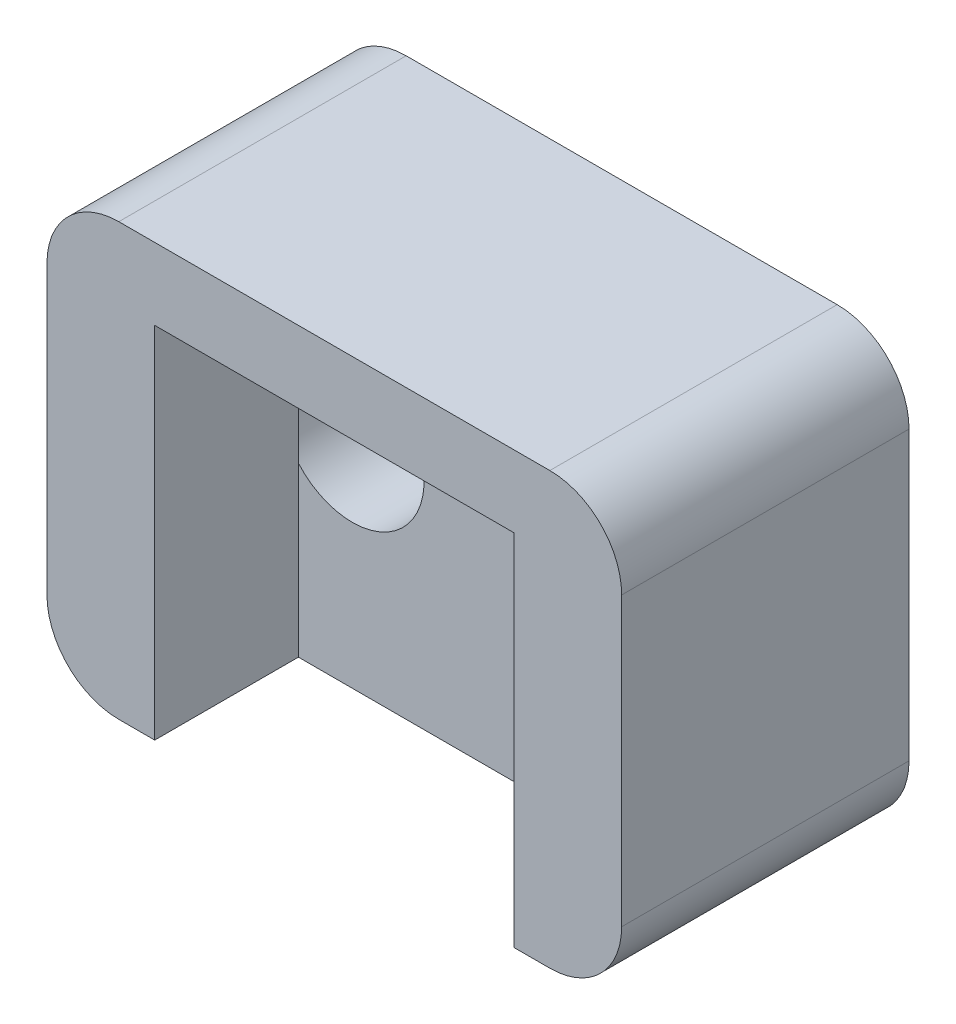
ISO-10303-21;
HEADER;
FILE_DESCRIPTION(('STEP AP214'),'2;1');
FILE_NAME('part.step','',(''),(''),'','','');
FILE_SCHEMA(('AUTOMOTIVE_DESIGN { 1 0 10303 214 1 1 1 1 }'));
ENDSEC;
DATA;
#1=APPLICATION_CONTEXT('core data for automotive mechanical design processes');
#2=APPLICATION_PROTOCOL_DEFINITION('international standard','automotive_design',2000,#1);
#3=PRODUCT_CONTEXT('',#1,'mechanical');
#4=PRODUCT('Part','Part','',(#3));
#5=PRODUCT_RELATED_PRODUCT_CATEGORY('part','',(#4));
#6=PRODUCT_DEFINITION_FORMATION('','',#4);
#7=PRODUCT_DEFINITION_CONTEXT('part definition',#1,'design');
#8=PRODUCT_DEFINITION('design','',#6,#7);
#9=PRODUCT_DEFINITION_SHAPE('','',#8);
#10=(LENGTH_UNIT() NAMED_UNIT(*) SI_UNIT(.MILLI.,.METRE.));
#11=(NAMED_UNIT(*) PLANE_ANGLE_UNIT() SI_UNIT($,.RADIAN.));
#12=(NAMED_UNIT(*) SI_UNIT($,.STERADIAN.) SOLID_ANGLE_UNIT());
#13=UNCERTAINTY_MEASURE_WITH_UNIT(LENGTH_MEASURE(1.E-05),#10,'distance_accuracy_value','');
#14=(GEOMETRIC_REPRESENTATION_CONTEXT(3) GLOBAL_UNCERTAINTY_ASSIGNED_CONTEXT((#13)) GLOBAL_UNIT_ASSIGNED_CONTEXT((#10,
#11,#12)) REPRESENTATION_CONTEXT('',''));
#15=CARTESIAN_POINT('',(0.,0.,0.));
#16=DIRECTION('',(0.,0.,1.));
#17=DIRECTION('',(1.,0.,0.));
#18=AXIS2_PLACEMENT_3D('',#15,#16,#17);
#19=CARTESIAN_POINT('',(-8.75,0.,10.));
#20=DIRECTION('',(0.,0.,-1.));
#21=DIRECTION('',(-1.,0.,0.));
#22=AXIS2_PLACEMENT_3D('',#19,#20,#21);
#23=PLANE('',#22);
#24=CARTESIAN_POINT('',(-8.75,0.,10.));
#25=DIRECTION('',(0.,0.,-1.));
#26=DIRECTION('',(-1.,0.,0.));
#27=AXIS2_PLACEMENT_3D('',#24,#25,#26);
#28=CIRCLE('',#27,5.);
#29=CARTESIAN_POINT('',(-12.5,-3.30718913883073,10.));
#30=VERTEX_POINT('',#29);
#31=CARTESIAN_POINT('',(-12.5,3.30718913883073,10.));
#32=VERTEX_POINT('',#31);
#33=EDGE_CURVE('E188',#30,#32,#28,.T.);
#34=ORIENTED_EDGE('',*,*,#33,.T.);
#35=DIRECTION('',(0.,-1.,0.));
#36=VECTOR('',#35,1.);
#37=CARTESIAN_POINT('',(-12.5,-15.,10.));
#38=LINE('',#37,#36);
#39=EDGE_CURVE('E141',#32,#30,#38,.T.);
#40=ORIENTED_EDGE('',*,*,#39,.T.);
#41=EDGE_LOOP('',(#34,#40));
#42=FACE_BOUND('',#41,.T.);
#43=ADVANCED_FACE('F33',(#42),#23,.T.);
#44=CARTESIAN_POINT('',(8.75,0.,10.));
#45=DIRECTION('',(0.,0.,-1.));
#46=DIRECTION('',(-1.,0.,0.));
#47=AXIS2_PLACEMENT_3D('',#44,#45,#46);
#48=PLANE('',#47);
#49=CARTESIAN_POINT('',(8.75,0.,10.));
#50=DIRECTION('',(0.,0.,-1.));
#51=DIRECTION('',(-1.,0.,0.));
#52=AXIS2_PLACEMENT_3D('',#49,#50,#51);
#53=CIRCLE('',#52,5.);
#54=CARTESIAN_POINT('',(12.5,3.30718913883074,10.));
#55=VERTEX_POINT('',#54);
#56=CARTESIAN_POINT('',(12.5,-3.30718913883074,10.));
#57=VERTEX_POINT('',#56);
#58=EDGE_CURVE('E177',#55,#57,#53,.T.);
#59=ORIENTED_EDGE('',*,*,#58,.T.);
#60=DIRECTION('',(0.,1.,0.));
#61=VECTOR('',#60,1.);
#62=CARTESIAN_POINT('',(12.5,-15.,10.));
#63=LINE('',#62,#61);
#64=EDGE_CURVE('E159',#57,#55,#63,.T.);
#65=ORIENTED_EDGE('',*,*,#64,.T.);
#66=EDGE_LOOP('',(#59,#65));
#67=FACE_BOUND('',#66,.T.);
#68=ADVANCED_FACE('F291',(#67),#48,.T.);
#69=CARTESIAN_POINT('',(20.,15.,20.));
#70=DIRECTION('',(-1.,0.,0.));
#71=DIRECTION('',(0.,-1.,0.));
#72=AXIS2_PLACEMENT_3D('',#69,#70,#71);
#73=PLANE('',#72);
#74=DIRECTION('',(0.,1.,0.));
#75=VECTOR('',#74,1.);
#76=CARTESIAN_POINT('',(20.,15.,0.));
#77=LINE('',#76,#75);
#78=CARTESIAN_POINT('',(20.,-10.,0.));
#79=VERTEX_POINT('',#78);
#80=CARTESIAN_POINT('',(20.,10.,0.));
#81=VERTEX_POINT('',#80);
#82=EDGE_CURVE('E180',#79,#81,#77,.T.);
#83=ORIENTED_EDGE('',*,*,#82,.T.);
#84=DIRECTION('',(0.,0.,-1.));
#85=VECTOR('',#84,1.);
#86=CARTESIAN_POINT('',(20.,10.,20.));
#87=LINE('',#86,#85);
#88=CARTESIAN_POINT('',(20.,10.,20.));
#89=VERTEX_POINT('',#88);
#90=EDGE_CURVE('E228',#81,#89,#87,.F.);
#91=ORIENTED_EDGE('',*,*,#90,.T.);
#92=DIRECTION('',(0.,1.,0.));
#93=VECTOR('',#92,1.);
#94=CARTESIAN_POINT('',(20.,15.,20.));
#95=LINE('',#94,#93);
#96=CARTESIAN_POINT('',(20.,-10.,20.));
#97=VERTEX_POINT('',#96);
#98=EDGE_CURVE('E189',#97,#89,#95,.T.);
#99=ORIENTED_EDGE('',*,*,#98,.F.);
#100=DIRECTION('',(0.,0.,-1.));
#101=VECTOR('',#100,1.);
#102=CARTESIAN_POINT('',(20.,-10.,20.));
#103=LINE('',#102,#101);
#104=EDGE_CURVE('E225',#97,#79,#103,.T.);
#105=ORIENTED_EDGE('',*,*,#104,.T.);
#106=EDGE_LOOP('',(#83,#91,#99,#105));
#107=FACE_BOUND('',#106,.T.);
#108=ADVANCED_FACE('F273',(#107),#73,.F.);
#109=CARTESIAN_POINT('',(-20.,15.,20.));
#110=DIRECTION('',(0.,-1.,0.));
#111=DIRECTION('',(0.,0.,-1.));
#112=AXIS2_PLACEMENT_3D('',#109,#110,#111);
#113=PLANE('',#112);
#114=DIRECTION('',(-1.,0.,0.));
#115=VECTOR('',#114,1.);
#116=CARTESIAN_POINT('',(-20.,15.,20.));
#117=LINE('',#116,#115);
#118=CARTESIAN_POINT('',(15.,15.,20.));
#119=VERTEX_POINT('',#118);
#120=CARTESIAN_POINT('',(-15.,15.,20.));
#121=VERTEX_POINT('',#120);
#122=EDGE_CURVE('E192',#119,#121,#117,.T.);
#123=ORIENTED_EDGE('',*,*,#122,.F.);
#124=DIRECTION('',(0.,0.,-1.));
#125=VECTOR('',#124,1.);
#126=CARTESIAN_POINT('',(15.,15.,20.));
#127=LINE('',#126,#125);
#128=CARTESIAN_POINT('',(15.,15.,0.));
#129=VERTEX_POINT('',#128);
#130=EDGE_CURVE('E214',#119,#129,#127,.T.);
#131=ORIENTED_EDGE('',*,*,#130,.T.);
#132=DIRECTION('',(-1.,0.,0.));
#133=VECTOR('',#132,1.);
#134=CARTESIAN_POINT('',(-20.,15.,0.));
#135=LINE('',#134,#133);
#136=CARTESIAN_POINT('',(-15.,15.,0.));
#137=VERTEX_POINT('',#136);
#138=EDGE_CURVE('E205',#129,#137,#135,.T.);
#139=ORIENTED_EDGE('',*,*,#138,.T.);
#140=DIRECTION('',(0.,0.,-1.));
#141=VECTOR('',#140,1.);
#142=CARTESIAN_POINT('',(-15.,15.,20.));
#143=LINE('',#142,#141);
#144=EDGE_CURVE('E202',#137,#121,#143,.F.);
#145=ORIENTED_EDGE('',*,*,#144,.T.);
#146=EDGE_LOOP('',(#123,#131,#139,#145));
#147=FACE_BOUND('',#146,.T.);
#148=ADVANCED_FACE('F267',(#147),#113,.F.);
#149=CARTESIAN_POINT('',(-20.,15.,20.));
#150=DIRECTION('',(1.,0.,0.));
#151=DIRECTION('',(0.,1.,0.));
#152=AXIS2_PLACEMENT_3D('',#149,#150,#151);
#153=PLANE('',#152);
#154=DIRECTION('',(0.,-1.,0.));
#155=VECTOR('',#154,1.);
#156=CARTESIAN_POINT('',(-20.,15.,0.));
#157=LINE('',#156,#155);
#158=CARTESIAN_POINT('',(-20.,10.,0.));
#159=VERTEX_POINT('',#158);
#160=CARTESIAN_POINT('',(-20.,-10.,0.));
#161=VERTEX_POINT('',#160);
#162=EDGE_CURVE('E208',#159,#161,#157,.T.);
#163=ORIENTED_EDGE('',*,*,#162,.T.);
#164=DIRECTION('',(0.,0.,-1.));
#165=VECTOR('',#164,1.);
#166=CARTESIAN_POINT('',(-20.,-10.,20.));
#167=LINE('',#166,#165);
#168=CARTESIAN_POINT('',(-20.,-10.,20.));
#169=VERTEX_POINT('',#168);
#170=EDGE_CURVE('E11',#161,#169,#167,.F.);
#171=ORIENTED_EDGE('',*,*,#170,.T.);
#172=DIRECTION('',(0.,-1.,0.));
#173=VECTOR('',#172,1.);
#174=CARTESIAN_POINT('',(-20.,15.,20.));
#175=LINE('',#174,#173);
#176=CARTESIAN_POINT('',(-20.,10.,20.));
#177=VERTEX_POINT('',#176);
#178=EDGE_CURVE('E196',#177,#169,#175,.T.);
#179=ORIENTED_EDGE('',*,*,#178,.F.);
#180=DIRECTION('',(0.,0.,-1.));
#181=VECTOR('',#180,1.);
#182=CARTESIAN_POINT('',(-20.,10.,20.));
#183=LINE('',#182,#181);
#184=EDGE_CURVE('E41',#177,#159,#183,.T.);
#185=ORIENTED_EDGE('',*,*,#184,.T.);
#186=EDGE_LOOP('',(#163,#171,#179,#185));
#187=FACE_BOUND('',#186,.T.);
#188=ADVANCED_FACE('F248',(#187),#153,.F.);
#189=CARTESIAN_POINT('',(-20.,-15.,20.));
#190=DIRECTION('',(0.,1.,0.));
#191=DIRECTION('',(0.,0.,1.));
#192=AXIS2_PLACEMENT_3D('',#189,#190,#191);
#193=PLANE('',#192);
#194=DIRECTION('',(1.,0.,0.));
#195=VECTOR('',#194,1.);
#196=CARTESIAN_POINT('',(-12.5,-15.,10.));
#197=LINE('',#196,#195);
#198=CARTESIAN_POINT('',(-12.5,-15.,10.));
#199=VERTEX_POINT('',#198);
#200=CARTESIAN_POINT('',(12.5,-15.,10.));
#201=VERTEX_POINT('',#200);
#202=EDGE_CURVE('E135',#199,#201,#197,.T.);
#203=ORIENTED_EDGE('',*,*,#202,.F.);
#204=DIRECTION('',(0.,0.,1.));
#205=VECTOR('',#204,1.);
#206=CARTESIAN_POINT('',(-12.5,-15.,10.));
#207=LINE('',#206,#205);
#208=CARTESIAN_POINT('',(-12.5,-15.,20.));
#209=VERTEX_POINT('',#208);
#210=EDGE_CURVE('E146',#199,#209,#207,.T.);
#211=ORIENTED_EDGE('',*,*,#210,.T.);
#212=DIRECTION('',(1.,0.,0.));
#213=VECTOR('',#212,1.);
#214=CARTESIAN_POINT('',(-20.,-15.,20.));
#215=LINE('',#214,#213);
#216=CARTESIAN_POINT('',(-15.,-15.,20.));
#217=VERTEX_POINT('',#216);
#218=EDGE_CURVE('E200',#217,#209,#215,.T.);
#219=ORIENTED_EDGE('',*,*,#218,.F.);
#220=DIRECTION('',(0.,0.,-1.));
#221=VECTOR('',#220,1.);
#222=CARTESIAN_POINT('',(-15.,-15.,20.));
#223=LINE('',#222,#221);
#224=CARTESIAN_POINT('',(-15.,-15.,0.));
#225=VERTEX_POINT('',#224);
#226=EDGE_CURVE('E238',#217,#225,#223,.T.);
#227=ORIENTED_EDGE('',*,*,#226,.T.);
#228=DIRECTION('',(1.,0.,0.));
#229=VECTOR('',#228,1.);
#230=CARTESIAN_POINT('',(-20.,-15.,0.));
#231=LINE('',#230,#229);
#232=CARTESIAN_POINT('',(15.,-15.,0.));
#233=VERTEX_POINT('',#232);
#234=EDGE_CURVE('E193',#225,#233,#231,.T.);
#235=ORIENTED_EDGE('',*,*,#234,.T.);
#236=DIRECTION('',(0.,0.,-1.));
#237=VECTOR('',#236,1.);
#238=CARTESIAN_POINT('',(15.,-15.,20.));
#239=LINE('',#238,#237);
#240=CARTESIAN_POINT('',(15.,-15.,20.));
#241=VERTEX_POINT('',#240);
#242=EDGE_CURVE('E241',#233,#241,#239,.F.);
#243=ORIENTED_EDGE('',*,*,#242,.T.);
#244=CARTESIAN_POINT('',(12.5,-15.,20.));
#245=VERTEX_POINT('',#244);
#246=EDGE_CURVE('E199',#245,#241,#215,.T.);
#247=ORIENTED_EDGE('',*,*,#246,.F.);
#248=DIRECTION('',(0.,0.,1.));
#249=VECTOR('',#248,1.);
#250=CARTESIAN_POINT('',(12.5,-15.,10.));
#251=LINE('',#250,#249);
#252=EDGE_CURVE('E153',#201,#245,#251,.T.);
#253=ORIENTED_EDGE('',*,*,#252,.F.);
#254=EDGE_LOOP('',(#203,#211,#219,#227,#235,#243,#247,#253));
#255=FACE_BOUND('',#254,.T.);
#256=ADVANCED_FACE('F156',(#255),#193,.F.);
#257=CARTESIAN_POINT('',(0.,0.,20.));
#258=DIRECTION('',(0.,0.,1.));
#259=DIRECTION('',(1.,0.,0.));
#260=AXIS2_PLACEMENT_3D('',#257,#258,#259);
#261=PLANE('',#260);
#262=DIRECTION('',(0.,-1.,0.));
#263=VECTOR('',#262,1.);
#264=CARTESIAN_POINT('',(-12.5,-15.,20.));
#265=LINE('',#264,#263);
#266=CARTESIAN_POINT('',(-12.5,10.,20.));
#267=VERTEX_POINT('',#266);
#268=EDGE_CURVE('E149',#267,#209,#265,.T.);
#269=ORIENTED_EDGE('',*,*,#268,.F.);
#270=DIRECTION('',(-1.,0.,0.));
#271=VECTOR('',#270,1.);
#272=CARTESIAN_POINT('',(-12.5,10.,20.));
#273=LINE('',#272,#271);
#274=CARTESIAN_POINT('',(12.5,10.,20.));
#275=VERTEX_POINT('',#274);
#276=EDGE_CURVE('E142',#275,#267,#273,.T.);
#277=ORIENTED_EDGE('',*,*,#276,.F.);
#278=DIRECTION('',(0.,1.,0.));
#279=VECTOR('',#278,1.);
#280=CARTESIAN_POINT('',(12.5,-15.,20.));
#281=LINE('',#280,#279);
#282=EDGE_CURVE('E166',#245,#275,#281,.T.);
#283=ORIENTED_EDGE('',*,*,#282,.F.);
#284=ORIENTED_EDGE('',*,*,#246,.T.);
#285=CARTESIAN_POINT('',(15.,-10.,20.));
#286=DIRECTION('',(0.,0.,1.));
#287=DIRECTION('',(1.,0.,0.));
#288=AXIS2_PLACEMENT_3D('',#285,#286,#287);
#289=CIRCLE('',#288,5.);
#290=EDGE_CURVE('E234',#241,#97,#289,.T.);
#291=ORIENTED_EDGE('',*,*,#290,.T.);
#292=ORIENTED_EDGE('',*,*,#98,.T.);
#293=CARTESIAN_POINT('',(15.,10.,20.));
#294=DIRECTION('',(0.,0.,1.));
#295=DIRECTION('',(1.,0.,0.));
#296=AXIS2_PLACEMENT_3D('',#293,#294,#295);
#297=CIRCLE('',#296,5.);
#298=EDGE_CURVE('E236',#89,#119,#297,.T.);
#299=ORIENTED_EDGE('',*,*,#298,.T.);
#300=ORIENTED_EDGE('',*,*,#122,.T.);
#301=CARTESIAN_POINT('',(-15.,10.,20.));
#302=DIRECTION('',(0.,0.,1.));
#303=DIRECTION('',(1.,0.,0.));
#304=AXIS2_PLACEMENT_3D('',#301,#302,#303);
#305=CIRCLE('',#304,5.);
#306=EDGE_CURVE('E230',#121,#177,#305,.T.);
#307=ORIENTED_EDGE('',*,*,#306,.T.);
#308=ORIENTED_EDGE('',*,*,#178,.T.);
#309=CARTESIAN_POINT('',(-15.,-10.,20.));
#310=DIRECTION('',(0.,0.,1.));
#311=DIRECTION('',(1.,0.,0.));
#312=AXIS2_PLACEMENT_3D('',#309,#310,#311);
#313=CIRCLE('',#312,5.);
#314=EDGE_CURVE('E232',#169,#217,#313,.T.);
#315=ORIENTED_EDGE('',*,*,#314,.T.);
#316=ORIENTED_EDGE('',*,*,#218,.T.);
#317=EDGE_LOOP('',(#269,#277,#283,#284,#291,#292,#299,#300,#307,#308,#315,#316));
#318=FACE_BOUND('',#317,.T.);
#319=ADVANCED_FACE('F262',(#318),#261,.T.);
#320=CARTESIAN_POINT('',(0.,0.,0.));
#321=DIRECTION('',(0.,0.,1.));
#322=DIRECTION('',(1.,0.,0.));
#323=AXIS2_PLACEMENT_3D('',#320,#321,#322);
#324=PLANE('',#323);
#325=CARTESIAN_POINT('',(8.75,0.,0.));
#326=DIRECTION('',(0.,0.,-1.));
#327=DIRECTION('',(-1.,0.,0.));
#328=AXIS2_PLACEMENT_3D('',#325,#326,#327);
#329=CIRCLE('',#328,5.);
#330=CARTESIAN_POINT('',(3.75,0.,0.));
#331=VERTEX_POINT('',#330);
#332=EDGE_CURVE('E181',#331,#331,#329,.T.);
#333=ORIENTED_EDGE('',*,*,#332,.F.);
#334=EDGE_LOOP('',(#333));
#335=FACE_BOUND('',#334,.T.);
#336=CARTESIAN_POINT('',(-8.75,0.,0.));
#337=DIRECTION('',(0.,0.,-1.));
#338=DIRECTION('',(-1.,0.,0.));
#339=AXIS2_PLACEMENT_3D('',#336,#337,#338);
#340=CIRCLE('',#339,5.);
#341=CARTESIAN_POINT('',(-13.75,0.,0.));
#342=VERTEX_POINT('',#341);
#343=EDGE_CURVE('E184',#342,#342,#340,.T.);
#344=ORIENTED_EDGE('',*,*,#343,.F.);
#345=EDGE_LOOP('',(#344));
#346=FACE_BOUND('',#345,.T.);
#347=ORIENTED_EDGE('',*,*,#138,.F.);
#348=CARTESIAN_POINT('',(15.,10.,0.));
#349=DIRECTION('',(0.,0.,1.));
#350=DIRECTION('',(1.,0.,0.));
#351=AXIS2_PLACEMENT_3D('',#348,#349,#350);
#352=CIRCLE('',#351,5.);
#353=EDGE_CURVE('E223',#129,#81,#352,.F.);
#354=ORIENTED_EDGE('',*,*,#353,.T.);
#355=ORIENTED_EDGE('',*,*,#82,.F.);
#356=CARTESIAN_POINT('',(15.,-10.,0.));
#357=DIRECTION('',(0.,0.,1.));
#358=DIRECTION('',(1.,0.,0.));
#359=AXIS2_PLACEMENT_3D('',#356,#357,#358);
#360=CIRCLE('',#359,5.);
#361=EDGE_CURVE('E221',#79,#233,#360,.F.);
#362=ORIENTED_EDGE('',*,*,#361,.T.);
#363=ORIENTED_EDGE('',*,*,#234,.F.);
#364=CARTESIAN_POINT('',(-15.,-10.,0.));
#365=DIRECTION('',(0.,0.,1.));
#366=DIRECTION('',(1.,0.,0.));
#367=AXIS2_PLACEMENT_3D('',#364,#365,#366);
#368=CIRCLE('',#367,5.);
#369=EDGE_CURVE('E219',#225,#161,#368,.F.);
#370=ORIENTED_EDGE('',*,*,#369,.T.);
#371=ORIENTED_EDGE('',*,*,#162,.F.);
#372=CARTESIAN_POINT('',(-15.,10.,0.));
#373=DIRECTION('',(0.,0.,1.));
#374=DIRECTION('',(1.,0.,0.));
#375=AXIS2_PLACEMENT_3D('',#372,#373,#374);
#376=CIRCLE('',#375,5.);
#377=EDGE_CURVE('E217',#159,#137,#376,.F.);
#378=ORIENTED_EDGE('',*,*,#377,.T.);
#379=EDGE_LOOP('',(#347,#354,#355,#362,#363,#370,#371,#378));
#380=FACE_BOUND('',#379,.T.);
#381=ADVANCED_FACE('F254',(#335,#346,#380),#324,.F.);
#382=CARTESIAN_POINT('',(15.,10.,20.));
#383=DIRECTION('',(0.,0.,-1.));
#384=DIRECTION('',(-1.,0.,0.));
#385=AXIS2_PLACEMENT_3D('',#382,#383,#384);
#386=CYLINDRICAL_SURFACE('',#385,5.);
#387=ORIENTED_EDGE('',*,*,#298,.F.);
#388=ORIENTED_EDGE('',*,*,#90,.F.);
#389=ORIENTED_EDGE('',*,*,#353,.F.);
#390=ORIENTED_EDGE('',*,*,#130,.F.);
#391=EDGE_LOOP('',(#387,#388,#389,#390));
#392=FACE_BOUND('',#391,.T.);
#393=ADVANCED_FACE('F277',(#392),#386,.T.);
#394=CARTESIAN_POINT('',(15.,-10.,20.));
#395=DIRECTION('',(0.,0.,-1.));
#396=DIRECTION('',(-1.,0.,0.));
#397=AXIS2_PLACEMENT_3D('',#394,#395,#396);
#398=CYLINDRICAL_SURFACE('',#397,5.);
#399=ORIENTED_EDGE('',*,*,#290,.F.);
#400=ORIENTED_EDGE('',*,*,#242,.F.);
#401=ORIENTED_EDGE('',*,*,#361,.F.);
#402=ORIENTED_EDGE('',*,*,#104,.F.);
#403=EDGE_LOOP('',(#399,#400,#401,#402));
#404=FACE_BOUND('',#403,.T.);
#405=ADVANCED_FACE('F280',(#404),#398,.T.);
#406=CARTESIAN_POINT('',(-15.,-10.,20.));
#407=DIRECTION('',(0.,0.,-1.));
#408=DIRECTION('',(-1.,0.,0.));
#409=AXIS2_PLACEMENT_3D('',#406,#407,#408);
#410=CYLINDRICAL_SURFACE('',#409,5.);
#411=ORIENTED_EDGE('',*,*,#314,.F.);
#412=ORIENTED_EDGE('',*,*,#170,.F.);
#413=ORIENTED_EDGE('',*,*,#369,.F.);
#414=ORIENTED_EDGE('',*,*,#226,.F.);
#415=EDGE_LOOP('',(#411,#412,#413,#414));
#416=FACE_BOUND('',#415,.T.);
#417=ADVANCED_FACE('F259',(#416),#410,.T.);
#418=CARTESIAN_POINT('',(-15.,10.,20.));
#419=DIRECTION('',(0.,0.,-1.));
#420=DIRECTION('',(-1.,0.,0.));
#421=AXIS2_PLACEMENT_3D('',#418,#419,#420);
#422=CYLINDRICAL_SURFACE('',#421,5.);
#423=ORIENTED_EDGE('',*,*,#306,.F.);
#424=ORIENTED_EDGE('',*,*,#144,.F.);
#425=ORIENTED_EDGE('',*,*,#377,.F.);
#426=ORIENTED_EDGE('',*,*,#184,.F.);
#427=EDGE_LOOP('',(#423,#424,#425,#426));
#428=FACE_BOUND('',#427,.T.);
#429=ADVANCED_FACE('F35',(#428),#422,.T.);
#430=CARTESIAN_POINT('',(-8.75,0.,10.));
#431=DIRECTION('',(0.,0.,-1.));
#432=DIRECTION('',(-1.,0.,0.));
#433=AXIS2_PLACEMENT_3D('',#430,#431,#432);
#434=CYLINDRICAL_SURFACE('',#433,5.);
#435=EDGE_CURVE('E139',#32,#30,#28,.T.);
#436=ORIENTED_EDGE('',*,*,#435,.F.);
#437=ORIENTED_EDGE('',*,*,#33,.F.);
#438=EDGE_LOOP('',(#436,#437));
#439=FACE_BOUND('',#438,.T.);
#440=ORIENTED_EDGE('',*,*,#343,.T.);
#441=EDGE_LOOP('',(#440));
#442=FACE_BOUND('',#441,.T.);
#443=ADVANCED_FACE('F306',(#439,#442),#434,.F.);
#444=CARTESIAN_POINT('',(8.75,0.,10.));
#445=DIRECTION('',(0.,0.,-1.));
#446=DIRECTION('',(-1.,0.,0.));
#447=AXIS2_PLACEMENT_3D('',#444,#445,#446);
#448=CYLINDRICAL_SURFACE('',#447,5.);
#449=ORIENTED_EDGE('',*,*,#58,.F.);
#450=EDGE_CURVE('E173',#57,#55,#53,.T.);
#451=ORIENTED_EDGE('',*,*,#450,.F.);
#452=EDGE_LOOP('',(#449,#451));
#453=FACE_BOUND('',#452,.T.);
#454=ORIENTED_EDGE('',*,*,#332,.T.);
#455=EDGE_LOOP('',(#454));
#456=FACE_BOUND('',#455,.T.);
#457=ADVANCED_FACE('F288',(#453,#456),#448,.F.);
#458=CARTESIAN_POINT('',(-12.5,-15.,10.));
#459=DIRECTION('',(-1.,0.,0.));
#460=DIRECTION('',(0.,0.,1.));
#461=AXIS2_PLACEMENT_3D('',#458,#459,#460);
#462=PLANE('',#461);
#463=ORIENTED_EDGE('',*,*,#268,.T.);
#464=ORIENTED_EDGE('',*,*,#210,.F.);
#465=EDGE_CURVE('E48',#30,#199,#38,.T.);
#466=ORIENTED_EDGE('',*,*,#465,.F.);
#467=ORIENTED_EDGE('',*,*,#39,.F.);
#468=CARTESIAN_POINT('',(-12.5,10.,10.));
#469=VERTEX_POINT('',#468);
#470=EDGE_CURVE('E144',#469,#32,#38,.T.);
#471=ORIENTED_EDGE('',*,*,#470,.F.);
#472=DIRECTION('',(0.,0.,1.));
#473=VECTOR('',#472,1.);
#474=CARTESIAN_POINT('',(-12.5,10.,10.));
#475=LINE('',#474,#473);
#476=EDGE_CURVE('E171',#469,#267,#475,.T.);
#477=ORIENTED_EDGE('',*,*,#476,.T.);
#478=EDGE_LOOP('',(#463,#464,#466,#467,#471,#477));
#479=FACE_BOUND('',#478,.T.);
#480=ADVANCED_FACE('F147',(#479),#462,.F.);
#481=CARTESIAN_POINT('',(-12.5,10.,10.));
#482=DIRECTION('',(0.,1.,0.));
#483=DIRECTION('',(0.,0.,1.));
#484=AXIS2_PLACEMENT_3D('',#481,#482,#483);
#485=PLANE('',#484);
#486=ORIENTED_EDGE('',*,*,#276,.T.);
#487=ORIENTED_EDGE('',*,*,#476,.F.);
#488=DIRECTION('',(-1.,0.,0.));
#489=VECTOR('',#488,1.);
#490=CARTESIAN_POINT('',(-12.5,10.,10.));
#491=LINE('',#490,#489);
#492=CARTESIAN_POINT('',(12.5,10.,10.));
#493=VERTEX_POINT('',#492);
#494=EDGE_CURVE('E154',#493,#469,#491,.T.);
#495=ORIENTED_EDGE('',*,*,#494,.F.);
#496=DIRECTION('',(0.,0.,1.));
#497=VECTOR('',#496,1.);
#498=CARTESIAN_POINT('',(12.5,10.,10.));
#499=LINE('',#498,#497);
#500=EDGE_CURVE('E174',#493,#275,#499,.T.);
#501=ORIENTED_EDGE('',*,*,#500,.T.);
#502=EDGE_LOOP('',(#486,#487,#495,#501));
#503=FACE_BOUND('',#502,.T.);
#504=ADVANCED_FACE('F346',(#503),#485,.F.);
#505=CARTESIAN_POINT('',(12.5,-15.,10.));
#506=DIRECTION('',(1.,0.,0.));
#507=DIRECTION('',(0.,0.,-1.));
#508=AXIS2_PLACEMENT_3D('',#505,#506,#507);
#509=PLANE('',#508);
#510=ORIENTED_EDGE('',*,*,#282,.T.);
#511=ORIENTED_EDGE('',*,*,#500,.F.);
#512=EDGE_CURVE('E56',#55,#493,#63,.T.);
#513=ORIENTED_EDGE('',*,*,#512,.F.);
#514=ORIENTED_EDGE('',*,*,#64,.F.);
#515=EDGE_CURVE('E161',#201,#57,#63,.T.);
#516=ORIENTED_EDGE('',*,*,#515,.F.);
#517=ORIENTED_EDGE('',*,*,#252,.T.);
#518=EDGE_LOOP('',(#510,#511,#513,#514,#516,#517));
#519=FACE_BOUND('',#518,.T.);
#520=ADVANCED_FACE('F282',(#519),#509,.F.);
#521=CARTESIAN_POINT('',(0.,0.,10.));
#522=DIRECTION('',(0.,0.,-1.));
#523=DIRECTION('',(-1.,0.,0.));
#524=AXIS2_PLACEMENT_3D('',#521,#522,#523);
#525=PLANE('',#524);
#526=ORIENTED_EDGE('',*,*,#435,.T.);
#527=ORIENTED_EDGE('',*,*,#465,.T.);
#528=ORIENTED_EDGE('',*,*,#202,.T.);
#529=ORIENTED_EDGE('',*,*,#515,.T.);
#530=ORIENTED_EDGE('',*,*,#450,.T.);
#531=ORIENTED_EDGE('',*,*,#512,.T.);
#532=ORIENTED_EDGE('',*,*,#494,.T.);
#533=ORIENTED_EDGE('',*,*,#470,.T.);
#534=EDGE_LOOP('',(#526,#527,#528,#529,#530,#531,#532,#533));
#535=FACE_BOUND('',#534,.T.);
#536=ADVANCED_FACE('F132',(#535),#525,.F.);
#537=CLOSED_SHELL('',(#43,#68,#108,#148,#188,#256,#319,#381,#393,#405,#417,#429,#443,#457,#480,
#504,#520,#536));
#538=MANIFOLD_SOLID_BREP('B2',#537);
#539=ADVANCED_BREP_SHAPE_REPRESENTATION('',(#18,#538),#14);
#540=SHAPE_DEFINITION_REPRESENTATION(#9,#539);
ENDSEC;
END-ISO-10303-21;
